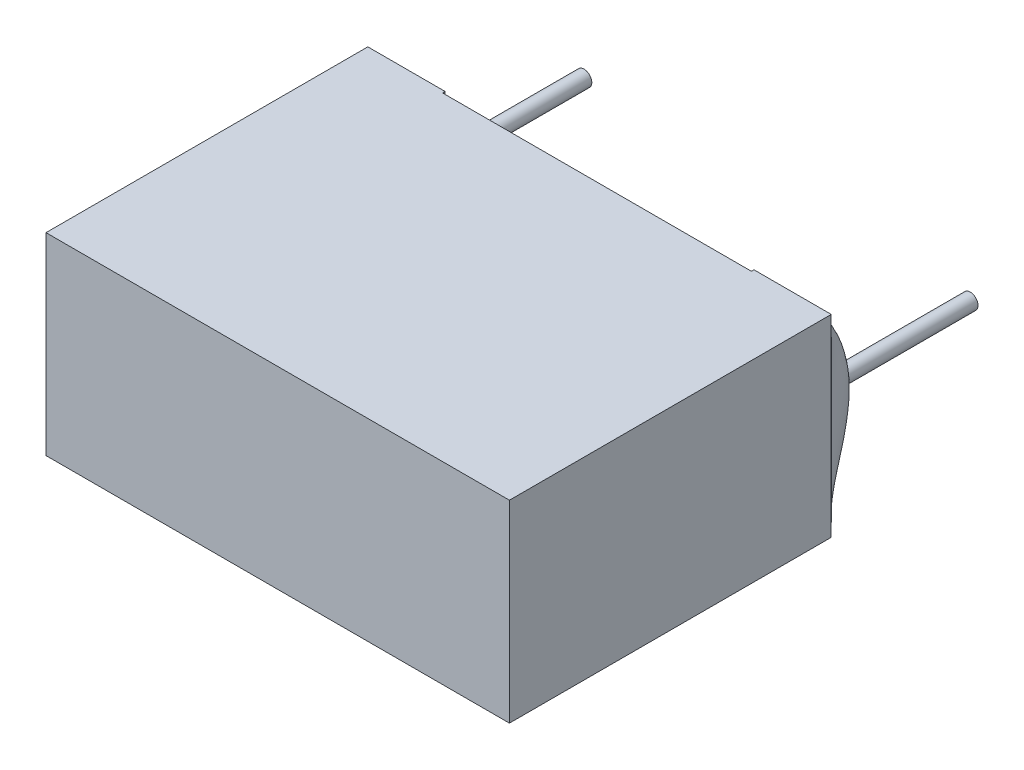
ISO-10303-21;
HEADER;
FILE_DESCRIPTION(('STEP AP214'),'2;1');
FILE_NAME('part.step','',(''),(''),'','','');
FILE_SCHEMA(('AUTOMOTIVE_DESIGN { 1 0 10303 214 1 1 1 1 }'));
ENDSEC;
DATA;
#1=APPLICATION_CONTEXT('core data for automotive mechanical design processes');
#2=APPLICATION_PROTOCOL_DEFINITION('international standard','automotive_design',2000,#1);
#3=PRODUCT_CONTEXT('',#1,'mechanical');
#4=PRODUCT('Part','Part','',(#3));
#5=PRODUCT_RELATED_PRODUCT_CATEGORY('part','',(#4));
#6=PRODUCT_DEFINITION_FORMATION('','',#4);
#7=PRODUCT_DEFINITION_CONTEXT('part definition',#1,'design');
#8=PRODUCT_DEFINITION('design','',#6,#7);
#9=PRODUCT_DEFINITION_SHAPE('','',#8);
#10=(LENGTH_UNIT() NAMED_UNIT(*) SI_UNIT(.MILLI.,.METRE.));
#11=(NAMED_UNIT(*) PLANE_ANGLE_UNIT() SI_UNIT($,.RADIAN.));
#12=(NAMED_UNIT(*) SI_UNIT($,.STERADIAN.) SOLID_ANGLE_UNIT());
#13=UNCERTAINTY_MEASURE_WITH_UNIT(LENGTH_MEASURE(1.E-05),#10,'distance_accuracy_value','');
#14=(GEOMETRIC_REPRESENTATION_CONTEXT(3) GLOBAL_UNCERTAINTY_ASSIGNED_CONTEXT((#13)) GLOBAL_UNIT_ASSIGNED_CONTEXT((#10,
#11,#12)) REPRESENTATION_CONTEXT('',''));
#15=CARTESIAN_POINT('',(0.,0.,0.));
#16=DIRECTION('',(0.,0.,1.));
#17=DIRECTION('',(1.,0.,0.));
#18=AXIS2_PLACEMENT_3D('',#15,#16,#17);
#19=CARTESIAN_POINT('',(15.,0.,-20.));
#20=DIRECTION('',(0.,0.,1.));
#21=DIRECTION('',(1.,0.,0.));
#22=AXIS2_PLACEMENT_3D('',#19,#20,#21);
#23=CYLINDRICAL_SURFACE('',#22,0.3);
#24=CARTESIAN_POINT('',(15.,0.,-5.));
#25=DIRECTION('',(0.,0.,1.));
#26=DIRECTION('',(1.,0.,0.));
#27=AXIS2_PLACEMENT_3D('',#24,#25,#26);
#28=CIRCLE('',#27,0.3);
#29=CARTESIAN_POINT('',(15.3,0.,-5.));
#30=VERTEX_POINT('',#29);
#31=EDGE_CURVE('E43',#30,#30,#28,.F.);
#32=ORIENTED_EDGE('',*,*,#31,.F.);
#33=EDGE_LOOP('',(#32));
#34=FACE_BOUND('',#33,.T.);
#35=CARTESIAN_POINT('',(15.,0.,0.));
#36=DIRECTION('',(0.,0.,1.));
#37=DIRECTION('',(1.,0.,0.));
#38=AXIS2_PLACEMENT_3D('',#35,#36,#37);
#39=CIRCLE('',#38,0.3);
#40=CARTESIAN_POINT('',(15.3,0.,0.));
#41=VERTEX_POINT('',#40);
#42=EDGE_CURVE('E11',#41,#41,#39,.T.);
#43=ORIENTED_EDGE('',*,*,#42,.F.);
#44=EDGE_LOOP('',(#43));
#45=FACE_BOUND('',#44,.T.);
#46=ADVANCED_FACE('F40',(#34,#45),#23,.T.);
#47=CARTESIAN_POINT('',(15.,0.,0.));
#48=DIRECTION('',(0.,0.,1.));
#49=DIRECTION('',(1.,0.,0.));
#50=AXIS2_PLACEMENT_3D('',#47,#48,#49);
#51=PLANE('',#50);
#52=ORIENTED_EDGE('',*,*,#42,.T.);
#53=EDGE_LOOP('',(#52));
#54=FACE_BOUND('',#53,.T.);
#55=ADVANCED_FACE('F56',(#54),#51,.T.);
#56=CARTESIAN_POINT('',(18.222339675828,4.40702708144581,-5.));
#57=DIRECTION('',(0.,0.,1.));
#58=DIRECTION('',(1.,0.,0.));
#59=AXIS2_PLACEMENT_3D('',#56,#57,#58);
#60=PLANE('',#59);
#61=ORIENTED_EDGE('',*,*,#31,.T.);
#62=EDGE_LOOP('',(#61));
#63=FACE_BOUND('',#62,.T.);
#64=ADVANCED_FACE('F52',(#63),#60,.F.);
#65=CLOSED_SHELL('',(#46,#55,#64));
#66=MANIFOLD_SOLID_BREP('B2',#65);
#67=CARTESIAN_POINT('',(0.,0.,-20.));
#68=DIRECTION('',(0.,0.,1.));
#69=DIRECTION('',(1.,0.,0.));
#70=AXIS2_PLACEMENT_3D('',#67,#68,#69);
#71=CYLINDRICAL_SURFACE('',#70,0.3);
#72=CARTESIAN_POINT('',(0.,0.,-5.));
#73=DIRECTION('',(0.,0.,1.));
#74=DIRECTION('',(1.,0.,0.));
#75=AXIS2_PLACEMENT_3D('',#72,#73,#74);
#76=CIRCLE('',#75,0.3);
#77=CARTESIAN_POINT('',(0.3,0.,-5.));
#78=VERTEX_POINT('',#77);
#79=EDGE_CURVE('E93',#78,#78,#76,.F.);
#80=ORIENTED_EDGE('',*,*,#79,.F.);
#81=EDGE_LOOP('',(#80));
#82=FACE_BOUND('',#81,.T.);
#83=CARTESIAN_POINT('',(0.,0.,0.));
#84=DIRECTION('',(0.,0.,1.));
#85=DIRECTION('',(1.,0.,0.));
#86=AXIS2_PLACEMENT_3D('',#83,#84,#85);
#87=CIRCLE('',#86,0.3);
#88=CARTESIAN_POINT('',(0.3,0.,0.));
#89=VERTEX_POINT('',#88);
#90=EDGE_CURVE('E39',#89,#89,#87,.T.);
#91=ORIENTED_EDGE('',*,*,#90,.F.);
#92=EDGE_LOOP('',(#91));
#93=FACE_BOUND('',#92,.T.);
#94=ADVANCED_FACE('F90',(#82,#93),#71,.T.);
#95=CARTESIAN_POINT('',(0.,0.,0.));
#96=DIRECTION('',(0.,0.,1.));
#97=DIRECTION('',(1.,0.,0.));
#98=AXIS2_PLACEMENT_3D('',#95,#96,#97);
#99=PLANE('',#98);
#100=ORIENTED_EDGE('',*,*,#90,.T.);
#101=EDGE_LOOP('',(#100));
#102=FACE_BOUND('',#101,.T.);
#103=ADVANCED_FACE('F106',(#102),#99,.T.);
#104=CARTESIAN_POINT('',(18.222339675828,4.40702708144581,-5.));
#105=DIRECTION('',(0.,0.,1.));
#106=DIRECTION('',(1.,0.,0.));
#107=AXIS2_PLACEMENT_3D('',#104,#105,#106);
#108=PLANE('',#107);
#109=ORIENTED_EDGE('',*,*,#79,.T.);
#110=EDGE_LOOP('',(#109));
#111=FACE_BOUND('',#110,.T.);
#112=ADVANCED_FACE('F102',(#111),#108,.F.);
#113=CLOSED_SHELL('',(#94,#103,#112));
#114=MANIFOLD_SOLID_BREP('B6',#113);
#115=CARTESIAN_POINT('',(-1.5,-3.75,2.));
#116=DIRECTION('',(0.,0.,-1.));
#117=DIRECTION('',(-1.,0.,0.));
#118=AXIS2_PLACEMENT_3D('',#115,#116,#117);
#119=PLANE('',#118);
#120=DIRECTION('',(1.,0.,0.));
#121=VECTOR('',#120,1.);
#122=CARTESIAN_POINT('',(16.5,-3.75,2.));
#123=LINE('',#122,#121);
#124=CARTESIAN_POINT('',(1.5,-3.75,2.));
#125=VERTEX_POINT('',#124);
#126=CARTESIAN_POINT('',(13.5,-3.75,2.));
#127=VERTEX_POINT('',#126);
#128=EDGE_CURVE('E230',#125,#127,#123,.T.);
#129=ORIENTED_EDGE('',*,*,#128,.F.);
#130=DIRECTION('',(0.,-1.,0.));
#131=VECTOR('',#130,1.);
#132=CARTESIAN_POINT('',(1.5,3.75,2.));
#133=LINE('',#132,#131);
#134=CARTESIAN_POINT('',(1.5,3.75,2.));
#135=VERTEX_POINT('',#134);
#136=EDGE_CURVE('E258',#135,#125,#133,.T.);
#137=ORIENTED_EDGE('',*,*,#136,.F.);
#138=DIRECTION('',(-1.,0.,0.));
#139=VECTOR('',#138,1.);
#140=CARTESIAN_POINT('',(-1.5,3.75,2.));
#141=LINE('',#140,#139);
#142=CARTESIAN_POINT('',(13.5,3.75,2.));
#143=VERTEX_POINT('',#142);
#144=EDGE_CURVE('E194',#143,#135,#141,.T.);
#145=ORIENTED_EDGE('',*,*,#144,.F.);
#146=DIRECTION('',(0.,1.,0.));
#147=VECTOR('',#146,1.);
#148=CARTESIAN_POINT('',(13.5,3.75,2.));
#149=LINE('',#148,#147);
#150=EDGE_CURVE('E239',#127,#143,#149,.T.);
#151=ORIENTED_EDGE('',*,*,#150,.F.);
#152=EDGE_LOOP('',(#129,#137,#145,#151));
#153=FACE_BOUND('',#152,.T.);
#154=ADVANCED_FACE('F131',(#153),#119,.T.);
#155=CARTESIAN_POINT('',(16.5,-3.75,14.4));
#156=DIRECTION('',(0.,1.,0.));
#157=DIRECTION('',(-1.,0.,0.));
#158=AXIS2_PLACEMENT_3D('',#155,#156,#157);
#159=PLANE('',#158);
#160=DIRECTION('',(0.,0.,-1.));
#161=VECTOR('',#160,1.);
#162=CARTESIAN_POINT('',(-1.5,-3.75,14.4));
#163=LINE('',#162,#161);
#164=CARTESIAN_POINT('',(-1.5,-3.75,14.4));
#165=VERTEX_POINT('',#164);
#166=CARTESIAN_POINT('',(-1.5,-3.75,1.9));
#167=VERTEX_POINT('',#166);
#168=EDGE_CURVE('E217',#165,#167,#163,.T.);
#169=ORIENTED_EDGE('',*,*,#168,.T.);
#170=DIRECTION('',(1.,0.,0.));
#171=VECTOR('',#170,1.);
#172=CARTESIAN_POINT('',(0.,-3.75,1.9));
#173=LINE('',#172,#171);
#174=CARTESIAN_POINT('',(1.5,-3.75,1.9));
#175=VERTEX_POINT('',#174);
#176=EDGE_CURVE('E259',#175,#167,#173,.F.);
#177=ORIENTED_EDGE('',*,*,#176,.F.);
#178=DIRECTION('',(0.,0.,1.));
#179=VECTOR('',#178,1.);
#180=CARTESIAN_POINT('',(1.5,-3.75,1.9));
#181=LINE('',#180,#179);
#182=EDGE_CURVE('E152',#175,#125,#181,.T.);
#183=ORIENTED_EDGE('',*,*,#182,.T.);
#184=ORIENTED_EDGE('',*,*,#128,.T.);
#185=DIRECTION('',(0.,0.,1.));
#186=VECTOR('',#185,1.);
#187=CARTESIAN_POINT('',(13.5,-3.75,1.9));
#188=LINE('',#187,#186);
#189=CARTESIAN_POINT('',(13.5,-3.75,1.9));
#190=VERTEX_POINT('',#189);
#191=EDGE_CURVE('E253',#190,#127,#188,.T.);
#192=ORIENTED_EDGE('',*,*,#191,.F.);
#193=DIRECTION('',(1.,0.,0.));
#194=VECTOR('',#193,1.);
#195=CARTESIAN_POINT('',(15.,-3.75,1.9));
#196=LINE('',#195,#194);
#197=CARTESIAN_POINT('',(16.5,-3.75,1.9));
#198=VERTEX_POINT('',#197);
#199=EDGE_CURVE('E137',#198,#190,#196,.F.);
#200=ORIENTED_EDGE('',*,*,#199,.F.);
#201=DIRECTION('',(0.,0.,-1.));
#202=VECTOR('',#201,1.);
#203=CARTESIAN_POINT('',(16.5,-3.75,14.4));
#204=LINE('',#203,#202);
#205=CARTESIAN_POINT('',(16.5,-3.75,14.4));
#206=VERTEX_POINT('',#205);
#207=EDGE_CURVE('E88',#206,#198,#204,.T.);
#208=ORIENTED_EDGE('',*,*,#207,.F.);
#209=DIRECTION('',(1.,0.,0.));
#210=VECTOR('',#209,1.);
#211=CARTESIAN_POINT('',(16.5,-3.75,14.4));
#212=LINE('',#211,#210);
#213=EDGE_CURVE('E212',#165,#206,#212,.T.);
#214=ORIENTED_EDGE('',*,*,#213,.F.);
#215=EDGE_LOOP('',(#169,#177,#183,#184,#192,#200,#208,#214));
#216=FACE_BOUND('',#215,.T.);
#217=ADVANCED_FACE('F226',(#216),#159,.F.);
#218=CARTESIAN_POINT('',(16.5,3.75,14.4));
#219=DIRECTION('',(-1.,0.,0.));
#220=DIRECTION('',(0.,0.,1.));
#221=AXIS2_PLACEMENT_3D('',#218,#219,#220);
#222=PLANE('',#221);
#223=ORIENTED_EDGE('',*,*,#207,.T.);
#224=DIRECTION('',(0.,1.,0.));
#225=VECTOR('',#224,1.);
#226=CARTESIAN_POINT('',(16.5,0.,1.9));
#227=LINE('',#226,#225);
#228=CARTESIAN_POINT('',(16.5,3.75,1.9));
#229=VERTEX_POINT('',#228);
#230=EDGE_CURVE('E242',#229,#198,#227,.F.);
#231=ORIENTED_EDGE('',*,*,#230,.F.);
#232=DIRECTION('',(0.,0.,-1.));
#233=VECTOR('',#232,1.);
#234=CARTESIAN_POINT('',(16.5,3.75,14.4));
#235=LINE('',#234,#233);
#236=CARTESIAN_POINT('',(16.5,3.75,14.4));
#237=VERTEX_POINT('',#236);
#238=EDGE_CURVE('E143',#237,#229,#235,.T.);
#239=ORIENTED_EDGE('',*,*,#238,.F.);
#240=DIRECTION('',(0.,1.,0.));
#241=VECTOR('',#240,1.);
#242=CARTESIAN_POINT('',(16.5,3.75,14.4));
#243=LINE('',#242,#241);
#244=EDGE_CURVE('E227',#206,#237,#243,.T.);
#245=ORIENTED_EDGE('',*,*,#244,.F.);
#246=EDGE_LOOP('',(#223,#231,#239,#245));
#247=FACE_BOUND('',#246,.T.);
#248=ADVANCED_FACE('F278',(#247),#222,.F.);
#249=CARTESIAN_POINT('',(-1.5,3.75,14.4));
#250=DIRECTION('',(0.,-1.,0.));
#251=DIRECTION('',(1.,0.,0.));
#252=AXIS2_PLACEMENT_3D('',#249,#250,#251);
#253=PLANE('',#252);
#254=ORIENTED_EDGE('',*,*,#238,.T.);
#255=DIRECTION('',(-1.,0.,0.));
#256=VECTOR('',#255,1.);
#257=CARTESIAN_POINT('',(15.,3.75,1.9));
#258=LINE('',#257,#256);
#259=CARTESIAN_POINT('',(13.5,3.75,1.9));
#260=VERTEX_POINT('',#259);
#261=EDGE_CURVE('E265',#260,#229,#258,.F.);
#262=ORIENTED_EDGE('',*,*,#261,.F.);
#263=DIRECTION('',(0.,0.,1.));
#264=VECTOR('',#263,1.);
#265=CARTESIAN_POINT('',(13.5,3.75,1.9));
#266=LINE('',#265,#264);
#267=EDGE_CURVE('E244',#260,#143,#266,.T.);
#268=ORIENTED_EDGE('',*,*,#267,.T.);
#269=ORIENTED_EDGE('',*,*,#144,.T.);
#270=DIRECTION('',(0.,0.,1.));
#271=VECTOR('',#270,1.);
#272=CARTESIAN_POINT('',(1.5,3.75,1.9));
#273=LINE('',#272,#271);
#274=CARTESIAN_POINT('',(1.5,3.75,1.9));
#275=VERTEX_POINT('',#274);
#276=EDGE_CURVE('E243',#275,#135,#273,.T.);
#277=ORIENTED_EDGE('',*,*,#276,.F.);
#278=DIRECTION('',(-1.,0.,0.));
#279=VECTOR('',#278,1.);
#280=CARTESIAN_POINT('',(0.,3.75,1.9));
#281=LINE('',#280,#279);
#282=CARTESIAN_POINT('',(-1.5,3.75,1.9));
#283=VERTEX_POINT('',#282);
#284=EDGE_CURVE('E257',#283,#275,#281,.F.);
#285=ORIENTED_EDGE('',*,*,#284,.F.);
#286=DIRECTION('',(0.,0.,-1.));
#287=VECTOR('',#286,1.);
#288=CARTESIAN_POINT('',(-1.5,3.75,14.4));
#289=LINE('',#288,#287);
#290=CARTESIAN_POINT('',(-1.5,3.75,14.4));
#291=VERTEX_POINT('',#290);
#292=EDGE_CURVE('E224',#291,#283,#289,.T.);
#293=ORIENTED_EDGE('',*,*,#292,.F.);
#294=DIRECTION('',(-1.,0.,0.));
#295=VECTOR('',#294,1.);
#296=CARTESIAN_POINT('',(-1.5,3.75,14.4));
#297=LINE('',#296,#295);
#298=EDGE_CURVE('E214',#237,#291,#297,.T.);
#299=ORIENTED_EDGE('',*,*,#298,.F.);
#300=EDGE_LOOP('',(#254,#262,#268,#269,#277,#285,#293,#299));
#301=FACE_BOUND('',#300,.T.);
#302=ADVANCED_FACE('F276',(#301),#253,.F.);
#303=CARTESIAN_POINT('',(-1.5,-3.75,14.4));
#304=DIRECTION('',(1.,0.,0.));
#305=DIRECTION('',(0.,0.,-1.));
#306=AXIS2_PLACEMENT_3D('',#303,#304,#305);
#307=PLANE('',#306);
#308=ORIENTED_EDGE('',*,*,#292,.T.);
#309=DIRECTION('',(0.,-1.,0.));
#310=VECTOR('',#309,1.);
#311=CARTESIAN_POINT('',(-1.5,0.,1.9));
#312=LINE('',#311,#310);
#313=EDGE_CURVE('E222',#167,#283,#312,.F.);
#314=ORIENTED_EDGE('',*,*,#313,.F.);
#315=ORIENTED_EDGE('',*,*,#168,.F.);
#316=DIRECTION('',(0.,-1.,0.));
#317=VECTOR('',#316,1.);
#318=CARTESIAN_POINT('',(-1.5,-3.75,14.4));
#319=LINE('',#318,#317);
#320=EDGE_CURVE('E208',#291,#165,#319,.T.);
#321=ORIENTED_EDGE('',*,*,#320,.F.);
#322=EDGE_LOOP('',(#308,#314,#315,#321));
#323=FACE_BOUND('',#322,.T.);
#324=ADVANCED_FACE('F220',(#323),#307,.F.);
#325=CARTESIAN_POINT('',(-1.5,-3.75,14.4));
#326=DIRECTION('',(0.,0.,-1.));
#327=DIRECTION('',(-1.,0.,0.));
#328=AXIS2_PLACEMENT_3D('',#325,#326,#327);
#329=PLANE('',#328);
#330=ORIENTED_EDGE('',*,*,#213,.T.);
#331=ORIENTED_EDGE('',*,*,#244,.T.);
#332=ORIENTED_EDGE('',*,*,#298,.T.);
#333=ORIENTED_EDGE('',*,*,#320,.T.);
#334=EDGE_LOOP('',(#330,#331,#332,#333));
#335=FACE_BOUND('',#334,.T.);
#336=ADVANCED_FACE('F210',(#335),#329,.F.);
#337=CARTESIAN_POINT('',(13.5,3.75,1.9));
#338=DIRECTION('',(1.,0.,0.));
#339=DIRECTION('',(0.,1.,0.));
#340=AXIS2_PLACEMENT_3D('',#337,#338,#339);
#341=PLANE('',#340);
#342=ORIENTED_EDGE('',*,*,#150,.T.);
#343=ORIENTED_EDGE('',*,*,#267,.F.);
#344=DIRECTION('',(0.,-1.,0.));
#345=VECTOR('',#344,1.);
#346=CARTESIAN_POINT('',(13.5,0.,1.9));
#347=LINE('',#346,#345);
#348=EDGE_CURVE('E267',#190,#260,#347,.F.);
#349=ORIENTED_EDGE('',*,*,#348,.F.);
#350=ORIENTED_EDGE('',*,*,#191,.T.);
#351=EDGE_LOOP('',(#342,#343,#349,#350));
#352=FACE_BOUND('',#351,.T.);
#353=ADVANCED_FACE('F274',(#352),#341,.F.);
#354=CARTESIAN_POINT('',(16.5,-3.75,1.9));
#355=CARTESIAN_POINT('',(15.5,-3.75,1.9));
#356=CARTESIAN_POINT('',(14.5,-3.75,1.9));
#357=CARTESIAN_POINT('',(13.5,-3.75,1.9));
#358=CARTESIAN_POINT('',(16.5,-1.25,1.9));
#359=CARTESIAN_POINT('',(15.5,-1.25,-1.47777777777778));
#360=CARTESIAN_POINT('',(14.5,-1.25,-1.47777777777778));
#361=CARTESIAN_POINT('',(13.5,-1.25,1.9));
#362=CARTESIAN_POINT('',(16.5,1.25,1.9));
#363=CARTESIAN_POINT('',(15.5,1.25,-1.47777777777778));
#364=CARTESIAN_POINT('',(14.5,1.25,-1.47777777777778));
#365=CARTESIAN_POINT('',(13.5,1.25,1.9));
#366=CARTESIAN_POINT('',(16.5,3.75,1.9));
#367=CARTESIAN_POINT('',(15.5,3.75,1.9));
#368=CARTESIAN_POINT('',(14.5,3.75,1.9));
#369=CARTESIAN_POINT('',(13.5,3.75,1.9));
#370=B_SPLINE_SURFACE_WITH_KNOTS('',3,3,((#354,#355,#356,#357),(#358,#359,#360,#361),(#362,#363,
#364,#365),(#366,#367,#368,#369)),.UNSPECIFIED.,.F.,.F.,.F.,(4,4),(4,4),(0.,1.),(0.,1.),.UNSPECIFIED.);
#371=ORIENTED_EDGE('',*,*,#230,.T.);
#372=ORIENTED_EDGE('',*,*,#199,.T.);
#373=ORIENTED_EDGE('',*,*,#348,.T.);
#374=ORIENTED_EDGE('',*,*,#261,.T.);
#375=EDGE_LOOP('',(#371,#372,#373,#374));
#376=FACE_BOUND('',#375,.T.);
#377=ADVANCED_FACE('F133',(#376),#370,.F.);
#378=CARTESIAN_POINT('',(1.5,3.75,1.9));
#379=DIRECTION('',(-1.,0.,0.));
#380=DIRECTION('',(0.,-1.,0.));
#381=AXIS2_PLACEMENT_3D('',#378,#379,#380);
#382=PLANE('',#381);
#383=ORIENTED_EDGE('',*,*,#136,.T.);
#384=ORIENTED_EDGE('',*,*,#182,.F.);
#385=DIRECTION('',(0.,1.,0.));
#386=VECTOR('',#385,1.);
#387=CARTESIAN_POINT('',(1.5,0.,1.9));
#388=LINE('',#387,#386);
#389=EDGE_CURVE('E261',#275,#175,#388,.F.);
#390=ORIENTED_EDGE('',*,*,#389,.F.);
#391=ORIENTED_EDGE('',*,*,#276,.T.);
#392=EDGE_LOOP('',(#383,#384,#390,#391));
#393=FACE_BOUND('',#392,.T.);
#394=ADVANCED_FACE('F318',(#393),#382,.F.);
#395=CARTESIAN_POINT('',(-1.5,3.75,1.9));
#396=CARTESIAN_POINT('',(-0.5,3.75,1.9));
#397=CARTESIAN_POINT('',(0.5,3.75,1.9));
#398=CARTESIAN_POINT('',(1.5,3.75,1.9));
#399=CARTESIAN_POINT('',(-1.5,1.25,1.9));
#400=CARTESIAN_POINT('',(-0.5,1.25,-1.47777777777778));
#401=CARTESIAN_POINT('',(0.5,1.25,-1.47777777777778));
#402=CARTESIAN_POINT('',(1.5,1.25,1.9));
#403=CARTESIAN_POINT('',(-1.5,-1.25,1.9));
#404=CARTESIAN_POINT('',(-0.5,-1.25,-1.47777777777778));
#405=CARTESIAN_POINT('',(0.5,-1.25,-1.47777777777778));
#406=CARTESIAN_POINT('',(1.5,-1.25,1.9));
#407=CARTESIAN_POINT('',(-1.5,-3.75,1.9));
#408=CARTESIAN_POINT('',(-0.5,-3.75,1.9));
#409=CARTESIAN_POINT('',(0.5,-3.75,1.9));
#410=CARTESIAN_POINT('',(1.5,-3.75,1.9));
#411=B_SPLINE_SURFACE_WITH_KNOTS('',3,3,((#395,#396,#397,#398),(#399,#400,#401,#402),(#403,#404,
#405,#406),(#407,#408,#409,#410)),.UNSPECIFIED.,.F.,.F.,.F.,(4,4),(4,4),(0.,1.),(0.,1.),.UNSPECIFIED.);
#412=ORIENTED_EDGE('',*,*,#313,.T.);
#413=ORIENTED_EDGE('',*,*,#284,.T.);
#414=ORIENTED_EDGE('',*,*,#389,.T.);
#415=ORIENTED_EDGE('',*,*,#176,.T.);
#416=EDGE_LOOP('',(#412,#413,#414,#415));
#417=FACE_BOUND('',#416,.T.);
#418=ADVANCED_FACE('F323',(#417),#411,.F.);
#419=CLOSED_SHELL('',(#154,#217,#248,#302,#324,#336,#353,#377,#394,#418));
#420=MANIFOLD_SOLID_BREP('B34',#419);
#421=ADVANCED_BREP_SHAPE_REPRESENTATION('',(#18,#66,#114,#420),#14);
#422=SHAPE_DEFINITION_REPRESENTATION(#9,#421);
ENDSEC;
END-ISO-10303-21;
